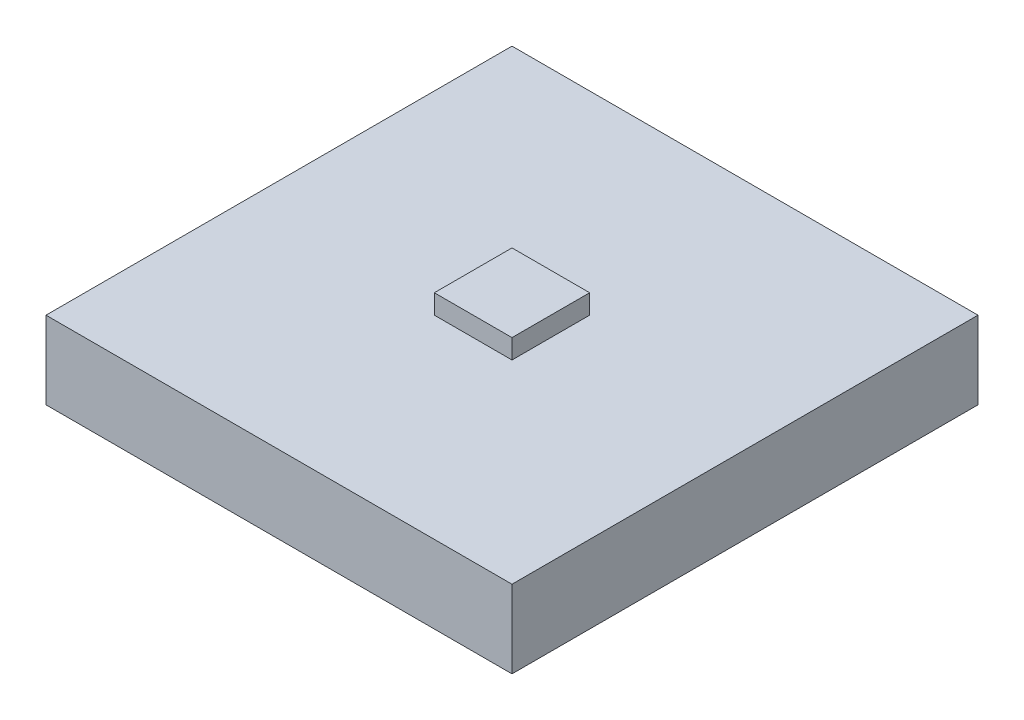
ISO-10303-21;
HEADER;
FILE_DESCRIPTION(('STEP AP214'),'2;1');
FILE_NAME('part.step','',(''),(''),'','','');
FILE_SCHEMA(('AUTOMOTIVE_DESIGN { 1 0 10303 214 1 1 1 1 }'));
ENDSEC;
DATA;
#1=APPLICATION_CONTEXT('core data for automotive mechanical design processes');
#2=APPLICATION_PROTOCOL_DEFINITION('international standard','automotive_design',2000,#1);
#3=PRODUCT_CONTEXT('',#1,'mechanical');
#4=PRODUCT('Part','Part','',(#3));
#5=PRODUCT_RELATED_PRODUCT_CATEGORY('part','',(#4));
#6=PRODUCT_DEFINITION_FORMATION('','',#4);
#7=PRODUCT_DEFINITION_CONTEXT('part definition',#1,'design');
#8=PRODUCT_DEFINITION('design','',#6,#7);
#9=PRODUCT_DEFINITION_SHAPE('','',#8);
#10=(LENGTH_UNIT() NAMED_UNIT(*) SI_UNIT(.MILLI.,.METRE.));
#11=(NAMED_UNIT(*) PLANE_ANGLE_UNIT() SI_UNIT($,.RADIAN.));
#12=(NAMED_UNIT(*) SI_UNIT($,.STERADIAN.) SOLID_ANGLE_UNIT());
#13=UNCERTAINTY_MEASURE_WITH_UNIT(LENGTH_MEASURE(1.E-05),#10,'distance_accuracy_value','');
#14=(GEOMETRIC_REPRESENTATION_CONTEXT(3) GLOBAL_UNCERTAINTY_ASSIGNED_CONTEXT((#13)) GLOBAL_UNIT_ASSIGNED_CONTEXT((#10,
#11,#12)) REPRESENTATION_CONTEXT('',''));
#15=CARTESIAN_POINT('',(0.,0.,0.));
#16=DIRECTION('',(0.,0.,1.));
#17=DIRECTION('',(1.,0.,0.));
#18=AXIS2_PLACEMENT_3D('',#15,#16,#17);
#19=CARTESIAN_POINT('',(0.,12.7,0.));
#20=DIRECTION('',(1.,0.,0.));
#21=DIRECTION('',(0.,0.,-1.));
#22=AXIS2_PLACEMENT_3D('',#19,#20,#21);
#23=PLANE('',#22);
#24=DIRECTION('',(0.,0.,1.));
#25=VECTOR('',#24,1.);
#26=CARTESIAN_POINT('',(0.,0.,0.));
#27=LINE('',#26,#25);
#28=CARTESIAN_POINT('',(0.,0.,-76.2));
#29=VERTEX_POINT('',#28);
#30=CARTESIAN_POINT('',(0.,0.,0.));
#31=VERTEX_POINT('',#30);
#32=EDGE_CURVE('E141',#29,#31,#27,.T.);
#33=ORIENTED_EDGE('',*,*,#32,.T.);
#34=DIRECTION('',(0.,-1.,0.));
#35=VECTOR('',#34,1.);
#36=CARTESIAN_POINT('',(0.,12.7,0.));
#37=LINE('',#36,#35);
#38=CARTESIAN_POINT('',(0.,12.7,0.));
#39=VERTEX_POINT('',#38);
#40=EDGE_CURVE('E11',#39,#31,#37,.T.);
#41=ORIENTED_EDGE('',*,*,#40,.F.);
#42=DIRECTION('',(0.,0.,1.));
#43=VECTOR('',#42,1.);
#44=CARTESIAN_POINT('',(0.,12.7,0.));
#45=LINE('',#44,#43);
#46=CARTESIAN_POINT('',(0.,12.7,-76.2));
#47=VERTEX_POINT('',#46);
#48=EDGE_CURVE('E145',#47,#39,#45,.T.);
#49=ORIENTED_EDGE('',*,*,#48,.F.);
#50=DIRECTION('',(0.,-1.,0.));
#51=VECTOR('',#50,1.);
#52=CARTESIAN_POINT('',(0.,12.7,-76.2));
#53=LINE('',#52,#51);
#54=EDGE_CURVE('E151',#47,#29,#53,.T.);
#55=ORIENTED_EDGE('',*,*,#54,.T.);
#56=EDGE_LOOP('',(#33,#41,#49,#55));
#57=FACE_BOUND('',#56,.T.);
#58=ADVANCED_FACE('F32',(#57),#23,.F.);
#59=CARTESIAN_POINT('',(0.,12.7,0.));
#60=DIRECTION('',(0.,0.,-1.));
#61=DIRECTION('',(-1.,0.,0.));
#62=AXIS2_PLACEMENT_3D('',#59,#60,#61);
#63=PLANE('',#62);
#64=DIRECTION('',(1.,0.,0.));
#65=VECTOR('',#64,1.);
#66=CARTESIAN_POINT('',(0.,0.,0.));
#67=LINE('',#66,#65);
#68=CARTESIAN_POINT('',(76.2,0.,0.));
#69=VERTEX_POINT('',#68);
#70=EDGE_CURVE('E154',#31,#69,#67,.T.);
#71=ORIENTED_EDGE('',*,*,#70,.T.);
#72=DIRECTION('',(0.,-1.,0.));
#73=VECTOR('',#72,1.);
#74=CARTESIAN_POINT('',(76.2,12.7,0.));
#75=LINE('',#74,#73);
#76=CARTESIAN_POINT('',(76.2,12.7,0.));
#77=VERTEX_POINT('',#76);
#78=EDGE_CURVE('E39',#77,#69,#75,.T.);
#79=ORIENTED_EDGE('',*,*,#78,.F.);
#80=DIRECTION('',(1.,0.,0.));
#81=VECTOR('',#80,1.);
#82=CARTESIAN_POINT('',(0.,12.7,0.));
#83=LINE('',#82,#81);
#84=EDGE_CURVE('E83',#39,#77,#83,.T.);
#85=ORIENTED_EDGE('',*,*,#84,.F.);
#86=ORIENTED_EDGE('',*,*,#40,.T.);
#87=EDGE_LOOP('',(#71,#79,#85,#86));
#88=FACE_BOUND('',#87,.T.);
#89=ADVANCED_FACE('F183',(#88),#63,.F.);
#90=CARTESIAN_POINT('',(76.2,12.7,0.));
#91=DIRECTION('',(-1.,0.,0.));
#92=DIRECTION('',(0.,0.,1.));
#93=AXIS2_PLACEMENT_3D('',#90,#91,#92);
#94=PLANE('',#93);
#95=DIRECTION('',(0.,0.,-1.));
#96=VECTOR('',#95,1.);
#97=CARTESIAN_POINT('',(76.2,0.,0.));
#98=LINE('',#97,#96);
#99=CARTESIAN_POINT('',(76.2,0.,-76.2));
#100=VERTEX_POINT('',#99);
#101=EDGE_CURVE('E156',#69,#100,#98,.T.);
#102=ORIENTED_EDGE('',*,*,#101,.T.);
#103=DIRECTION('',(0.,-1.,0.));
#104=VECTOR('',#103,1.);
#105=CARTESIAN_POINT('',(76.2,12.7,-76.2));
#106=LINE('',#105,#104);
#107=CARTESIAN_POINT('',(76.2,12.7,-76.2));
#108=VERTEX_POINT('',#107);
#109=EDGE_CURVE('E160',#108,#100,#106,.T.);
#110=ORIENTED_EDGE('',*,*,#109,.F.);
#111=DIRECTION('',(0.,0.,-1.));
#112=VECTOR('',#111,1.);
#113=CARTESIAN_POINT('',(76.2,12.7,0.));
#114=LINE('',#113,#112);
#115=EDGE_CURVE('E148',#77,#108,#114,.T.);
#116=ORIENTED_EDGE('',*,*,#115,.F.);
#117=ORIENTED_EDGE('',*,*,#78,.T.);
#118=EDGE_LOOP('',(#102,#110,#116,#117));
#119=FACE_BOUND('',#118,.T.);
#120=ADVANCED_FACE('F165',(#119),#94,.F.);
#121=CARTESIAN_POINT('',(0.,12.7,-76.2));
#122=DIRECTION('',(0.,0.,1.));
#123=DIRECTION('',(1.,0.,0.));
#124=AXIS2_PLACEMENT_3D('',#121,#122,#123);
#125=PLANE('',#124);
#126=DIRECTION('',(-1.,0.,0.));
#127=VECTOR('',#126,1.);
#128=CARTESIAN_POINT('',(0.,0.,-76.2));
#129=LINE('',#128,#127);
#130=EDGE_CURVE('E76',#100,#29,#129,.T.);
#131=ORIENTED_EDGE('',*,*,#130,.T.);
#132=ORIENTED_EDGE('',*,*,#54,.F.);
#133=DIRECTION('',(-1.,0.,0.));
#134=VECTOR('',#133,1.);
#135=CARTESIAN_POINT('',(0.,12.7,-76.2));
#136=LINE('',#135,#134);
#137=EDGE_CURVE('E55',#108,#47,#136,.T.);
#138=ORIENTED_EDGE('',*,*,#137,.F.);
#139=ORIENTED_EDGE('',*,*,#109,.T.);
#140=EDGE_LOOP('',(#131,#132,#138,#139));
#141=FACE_BOUND('',#140,.T.);
#142=ADVANCED_FACE('F173',(#141),#125,.F.);
#143=CARTESIAN_POINT('',(0.,12.7,0.));
#144=DIRECTION('',(0.,-1.,0.));
#145=DIRECTION('',(0.,0.,-1.));
#146=AXIS2_PLACEMENT_3D('',#143,#144,#145);
#147=PLANE('',#146);
#148=DIRECTION('',(1.,0.,0.));
#149=VECTOR('',#148,1.);
#150=CARTESIAN_POINT('',(31.75,12.7,-31.75));
#151=LINE('',#150,#149);
#152=CARTESIAN_POINT('',(31.75,12.7,-31.75));
#153=VERTEX_POINT('',#152);
#154=CARTESIAN_POINT('',(44.45,12.7,-31.75));
#155=VERTEX_POINT('',#154);
#156=EDGE_CURVE('E130',#153,#155,#151,.T.);
#157=ORIENTED_EDGE('',*,*,#156,.F.);
#158=DIRECTION('',(0.,0.,-1.));
#159=VECTOR('',#158,1.);
#160=CARTESIAN_POINT('',(31.75,12.7,-31.75));
#161=LINE('',#160,#159);
#162=CARTESIAN_POINT('',(31.75,12.7,-44.45));
#163=VERTEX_POINT('',#162);
#164=EDGE_CURVE('E136',#153,#163,#161,.T.);
#165=ORIENTED_EDGE('',*,*,#164,.T.);
#166=DIRECTION('',(1.,0.,0.));
#167=VECTOR('',#166,1.);
#168=CARTESIAN_POINT('',(31.75,12.7,-44.45));
#169=LINE('',#168,#167);
#170=CARTESIAN_POINT('',(44.45,12.7,-44.45));
#171=VERTEX_POINT('',#170);
#172=EDGE_CURVE('E112',#163,#171,#169,.T.);
#173=ORIENTED_EDGE('',*,*,#172,.T.);
#174=DIRECTION('',(0.,0.,-1.));
#175=VECTOR('',#174,1.);
#176=CARTESIAN_POINT('',(44.45,12.7,-31.75));
#177=LINE('',#176,#175);
#178=EDGE_CURVE('E46',#155,#171,#177,.T.);
#179=ORIENTED_EDGE('',*,*,#178,.F.);
#180=EDGE_LOOP('',(#157,#165,#173,#179));
#181=FACE_BOUND('',#180,.T.);
#182=ORIENTED_EDGE('',*,*,#48,.T.);
#183=ORIENTED_EDGE('',*,*,#84,.T.);
#184=ORIENTED_EDGE('',*,*,#115,.T.);
#185=ORIENTED_EDGE('',*,*,#137,.T.);
#186=EDGE_LOOP('',(#182,#183,#184,#185));
#187=FACE_BOUND('',#186,.T.);
#188=ADVANCED_FACE('F175',(#181,#187),#147,.F.);
#189=CARTESIAN_POINT('',(0.,0.,0.));
#190=DIRECTION('',(0.,-1.,0.));
#191=DIRECTION('',(0.,0.,-1.));
#192=AXIS2_PLACEMENT_3D('',#189,#190,#191);
#193=PLANE('',#192);
#194=ORIENTED_EDGE('',*,*,#32,.F.);
#195=ORIENTED_EDGE('',*,*,#130,.F.);
#196=ORIENTED_EDGE('',*,*,#101,.F.);
#197=ORIENTED_EDGE('',*,*,#70,.F.);
#198=EDGE_LOOP('',(#194,#195,#196,#197));
#199=FACE_BOUND('',#198,.T.);
#200=ADVANCED_FACE('F169',(#199),#193,.T.);
#201=CARTESIAN_POINT('',(31.75,15.875,-31.75));
#202=DIRECTION('',(-1.,0.,0.));
#203=DIRECTION('',(0.,0.,1.));
#204=AXIS2_PLACEMENT_3D('',#201,#202,#203);
#205=PLANE('',#204);
#206=ORIENTED_EDGE('',*,*,#164,.F.);
#207=DIRECTION('',(0.,-1.,0.));
#208=VECTOR('',#207,1.);
#209=CARTESIAN_POINT('',(31.75,15.875,-31.75));
#210=LINE('',#209,#208);
#211=CARTESIAN_POINT('',(31.75,15.875,-31.75));
#212=VERTEX_POINT('',#211);
#213=EDGE_CURVE('E128',#212,#153,#210,.T.);
#214=ORIENTED_EDGE('',*,*,#213,.F.);
#215=DIRECTION('',(0.,0.,-1.));
#216=VECTOR('',#215,1.);
#217=CARTESIAN_POINT('',(31.75,15.875,-31.75));
#218=LINE('',#217,#216);
#219=CARTESIAN_POINT('',(31.75,15.875,-44.45));
#220=VERTEX_POINT('',#219);
#221=EDGE_CURVE('E123',#212,#220,#218,.T.);
#222=ORIENTED_EDGE('',*,*,#221,.T.);
#223=DIRECTION('',(0.,-1.,0.));
#224=VECTOR('',#223,1.);
#225=CARTESIAN_POINT('',(31.75,15.875,-44.45));
#226=LINE('',#225,#224);
#227=EDGE_CURVE('E107',#220,#163,#226,.T.);
#228=ORIENTED_EDGE('',*,*,#227,.T.);
#229=EDGE_LOOP('',(#206,#214,#222,#228));
#230=FACE_BOUND('',#229,.T.);
#231=ADVANCED_FACE('F127',(#230),#205,.T.);
#232=CARTESIAN_POINT('',(31.75,15.875,-31.75));
#233=DIRECTION('',(0.,0.,-1.));
#234=DIRECTION('',(-1.,0.,0.));
#235=AXIS2_PLACEMENT_3D('',#232,#233,#234);
#236=PLANE('',#235);
#237=ORIENTED_EDGE('',*,*,#156,.T.);
#238=DIRECTION('',(0.,-1.,0.));
#239=VECTOR('',#238,1.);
#240=CARTESIAN_POINT('',(44.45,15.875,-31.75));
#241=LINE('',#240,#239);
#242=CARTESIAN_POINT('',(44.45,15.875,-31.75));
#243=VERTEX_POINT('',#242);
#244=EDGE_CURVE('E142',#243,#155,#241,.T.);
#245=ORIENTED_EDGE('',*,*,#244,.F.);
#246=DIRECTION('',(1.,0.,0.));
#247=VECTOR('',#246,1.);
#248=CARTESIAN_POINT('',(31.75,15.875,-31.75));
#249=LINE('',#248,#247);
#250=EDGE_CURVE('E118',#212,#243,#249,.T.);
#251=ORIENTED_EDGE('',*,*,#250,.F.);
#252=ORIENTED_EDGE('',*,*,#213,.T.);
#253=EDGE_LOOP('',(#237,#245,#251,#252));
#254=FACE_BOUND('',#253,.T.);
#255=ADVANCED_FACE('F222',(#254),#236,.F.);
#256=CARTESIAN_POINT('',(44.45,15.875,-31.75));
#257=DIRECTION('',(-1.,0.,0.));
#258=DIRECTION('',(0.,0.,1.));
#259=AXIS2_PLACEMENT_3D('',#256,#257,#258);
#260=PLANE('',#259);
#261=ORIENTED_EDGE('',*,*,#178,.T.);
#262=DIRECTION('',(0.,-1.,0.));
#263=VECTOR('',#262,1.);
#264=CARTESIAN_POINT('',(44.45,15.875,-44.45));
#265=LINE('',#264,#263);
#266=CARTESIAN_POINT('',(44.45,15.875,-44.45));
#267=VERTEX_POINT('',#266);
#268=EDGE_CURVE('E117',#267,#171,#265,.T.);
#269=ORIENTED_EDGE('',*,*,#268,.F.);
#270=DIRECTION('',(0.,0.,-1.));
#271=VECTOR('',#270,1.);
#272=CARTESIAN_POINT('',(44.45,15.875,-31.75));
#273=LINE('',#272,#271);
#274=EDGE_CURVE('E125',#243,#267,#273,.T.);
#275=ORIENTED_EDGE('',*,*,#274,.F.);
#276=ORIENTED_EDGE('',*,*,#244,.T.);
#277=EDGE_LOOP('',(#261,#269,#275,#276));
#278=FACE_BOUND('',#277,.T.);
#279=ADVANCED_FACE('F231',(#278),#260,.F.);
#280=CARTESIAN_POINT('',(31.75,15.875,-44.45));
#281=DIRECTION('',(0.,0.,-1.));
#282=DIRECTION('',(-1.,0.,0.));
#283=AXIS2_PLACEMENT_3D('',#280,#281,#282);
#284=PLANE('',#283);
#285=ORIENTED_EDGE('',*,*,#172,.F.);
#286=ORIENTED_EDGE('',*,*,#227,.F.);
#287=DIRECTION('',(1.,0.,0.));
#288=VECTOR('',#287,1.);
#289=CARTESIAN_POINT('',(31.75,15.875,-44.45));
#290=LINE('',#289,#288);
#291=EDGE_CURVE('E110',#220,#267,#290,.T.);
#292=ORIENTED_EDGE('',*,*,#291,.T.);
#293=ORIENTED_EDGE('',*,*,#268,.T.);
#294=EDGE_LOOP('',(#285,#286,#292,#293));
#295=FACE_BOUND('',#294,.T.);
#296=ADVANCED_FACE('F109',(#295),#284,.T.);
#297=CARTESIAN_POINT('',(0.,15.875,0.));
#298=DIRECTION('',(0.,-1.,0.));
#299=DIRECTION('',(0.,0.,-1.));
#300=AXIS2_PLACEMENT_3D('',#297,#298,#299);
#301=PLANE('',#300);
#302=ORIENTED_EDGE('',*,*,#221,.F.);
#303=ORIENTED_EDGE('',*,*,#250,.T.);
#304=ORIENTED_EDGE('',*,*,#274,.T.);
#305=ORIENTED_EDGE('',*,*,#291,.F.);
#306=EDGE_LOOP('',(#302,#303,#304,#305));
#307=FACE_BOUND('',#306,.T.);
#308=ADVANCED_FACE('F122',(#307),#301,.F.);
#309=CLOSED_SHELL('',(#58,#89,#120,#142,#188,#200,#231,#255,#279,#296,#308));
#310=MANIFOLD_SOLID_BREP('B2',#309);
#311=ADVANCED_BREP_SHAPE_REPRESENTATION('',(#18,#310),#14);
#312=SHAPE_DEFINITION_REPRESENTATION(#9,#311);
ENDSEC;
END-ISO-10303-21;
